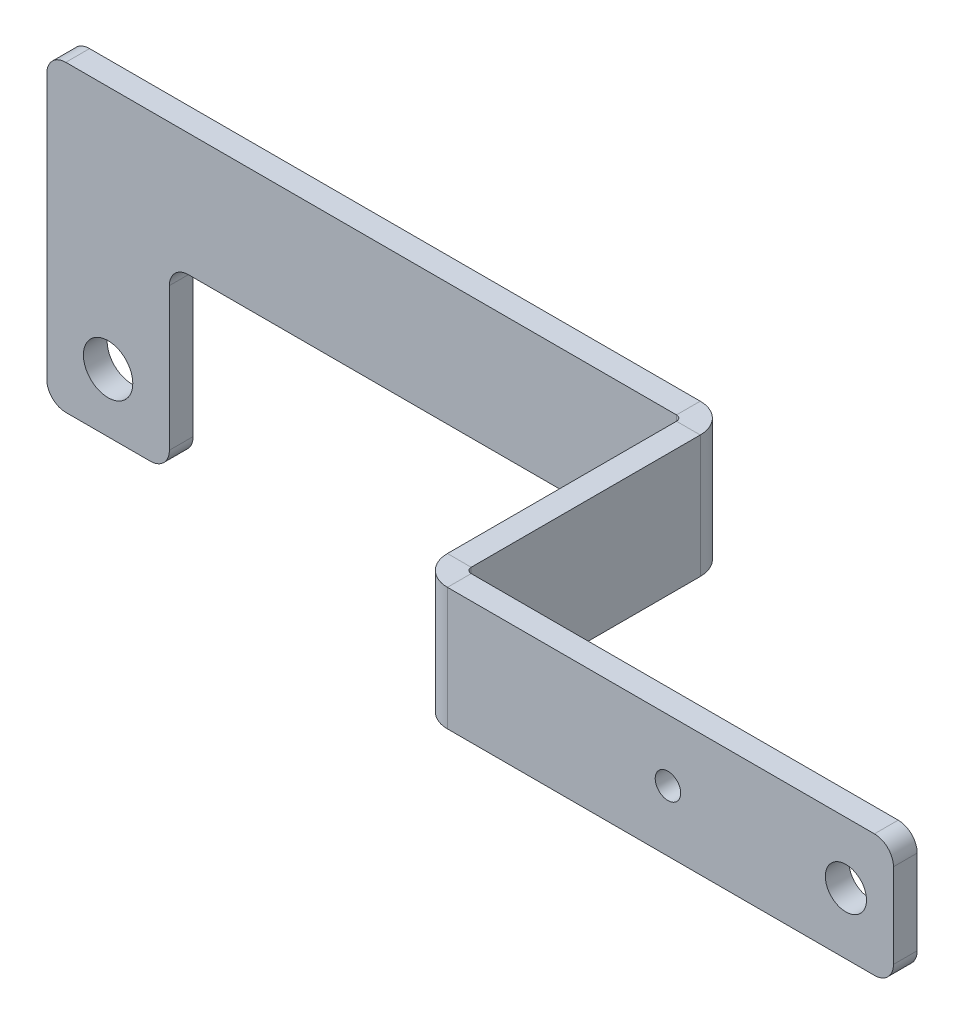
ISO-10303-21;
HEADER;
FILE_DESCRIPTION(('STEP AP214'),'2;1');
FILE_NAME('part.step','',(''),(''),'','','');
FILE_SCHEMA(('AUTOMOTIVE_DESIGN { 1 0 10303 214 1 1 1 1 }'));
ENDSEC;
DATA;
#1=APPLICATION_CONTEXT('core data for automotive mechanical design processes');
#2=APPLICATION_PROTOCOL_DEFINITION('international standard','automotive_design',2000,#1);
#3=PRODUCT_CONTEXT('',#1,'mechanical');
#4=PRODUCT('Part','Part','',(#3));
#5=PRODUCT_RELATED_PRODUCT_CATEGORY('part','',(#4));
#6=PRODUCT_DEFINITION_FORMATION('','',#4);
#7=PRODUCT_DEFINITION_CONTEXT('part definition',#1,'design');
#8=PRODUCT_DEFINITION('design','',#6,#7);
#9=PRODUCT_DEFINITION_SHAPE('','',#8);
#10=(LENGTH_UNIT() NAMED_UNIT(*) SI_UNIT(.MILLI.,.METRE.));
#11=(NAMED_UNIT(*) PLANE_ANGLE_UNIT() SI_UNIT($,.RADIAN.));
#12=(NAMED_UNIT(*) SI_UNIT($,.STERADIAN.) SOLID_ANGLE_UNIT());
#13=UNCERTAINTY_MEASURE_WITH_UNIT(LENGTH_MEASURE(1.E-05),#10,'distance_accuracy_value','');
#14=(GEOMETRIC_REPRESENTATION_CONTEXT(3) GLOBAL_UNCERTAINTY_ASSIGNED_CONTEXT((#13)) GLOBAL_UNIT_ASSIGNED_CONTEXT((#10,
#11,#12)) REPRESENTATION_CONTEXT('',''));
#15=CARTESIAN_POINT('',(0.,0.,0.));
#16=DIRECTION('',(0.,0.,1.));
#17=DIRECTION('',(1.,0.,0.));
#18=AXIS2_PLACEMENT_3D('',#15,#16,#17);
#19=CARTESIAN_POINT('',(65.8241,-45.5626000012021,0.));
#20=DIRECTION('',(0.,1.,0.));
#21=DIRECTION('',(0.,0.,1.));
#22=AXIS2_PLACEMENT_3D('',#19,#20,#21);
#23=PLANE('',#22);
#24=DIRECTION('',(-1.,0.,0.));
#25=VECTOR('',#24,1.);
#26=CARTESIAN_POINT('',(65.8241000000001,-45.5626000012021,31.3413));
#27=LINE('',#26,#25);
#28=CARTESIAN_POINT('',(65.8241000000001,-45.5626000012021,31.3413));
#29=VERTEX_POINT('',#28);
#30=CARTESIAN_POINT('',(62.6491000000001,-45.5626000012021,31.3413));
#31=VERTEX_POINT('',#30);
#32=EDGE_CURVE('E252',#29,#31,#27,.T.);
#33=ORIENTED_EDGE('',*,*,#32,.T.);
#34=DIRECTION('',(0.,0.,1.));
#35=VECTOR('',#34,1.);
#36=CARTESIAN_POINT('',(62.6491,-45.5626000012021,0.));
#37=LINE('',#36,#35);
#38=CARTESIAN_POINT('',(62.6491,-45.562600001202,0.736599999999997));
#39=VERTEX_POINT('',#38);
#40=EDGE_CURVE('E281',#31,#39,#37,.F.);
#41=ORIENTED_EDGE('',*,*,#40,.T.);
#42=DIRECTION('',(-1.,0.,0.));
#43=VECTOR('',#42,1.);
#44=CARTESIAN_POINT('',(65.8241,-45.5626000012021,0.736599999999986));
#45=LINE('',#44,#43);
#46=CARTESIAN_POINT('',(65.8241,-45.562600001202,0.736599999999986));
#47=VERTEX_POINT('',#46);
#48=EDGE_CURVE('E266',#39,#47,#45,.F.);
#49=ORIENTED_EDGE('',*,*,#48,.T.);
#50=DIRECTION('',(0.,0.,-1.));
#51=VECTOR('',#50,1.);
#52=CARTESIAN_POINT('',(65.8241,-45.5626000012021,-2.25365948582831E-13));
#53=LINE('',#52,#51);
#54=EDGE_CURVE('E274',#29,#47,#53,.T.);
#55=ORIENTED_EDGE('',*,*,#54,.F.);
#56=EDGE_LOOP('',(#33,#41,#49,#55));
#57=FACE_BOUND('',#56,.T.);
#58=ADVANCED_FACE('F60',(#57),#23,.F.);
#59=CARTESIAN_POINT('',(65.8241000000001,-29.1846000012021,32.0779));
#60=DIRECTION('',(0.,-1.,0.));
#61=DIRECTION('',(0.,0.,-1.));
#62=AXIS2_PLACEMENT_3D('',#59,#60,#61);
#63=PLANE('',#62);
#64=DIRECTION('',(-1.,0.,0.));
#65=VECTOR('',#64,1.);
#66=CARTESIAN_POINT('',(65.8241000000001,-29.1846000012021,31.3413));
#67=LINE('',#66,#65);
#68=CARTESIAN_POINT('',(65.8241000000001,-29.1846000012021,31.3413));
#69=VERTEX_POINT('',#68);
#70=CARTESIAN_POINT('',(62.6491000000001,-29.1846000012021,31.3413));
#71=VERTEX_POINT('',#70);
#72=EDGE_CURVE('E262',#69,#71,#67,.T.);
#73=ORIENTED_EDGE('',*,*,#72,.F.);
#74=DIRECTION('',(0.,0.,1.));
#75=VECTOR('',#74,1.);
#76=CARTESIAN_POINT('',(65.8241,-29.1846000012021,-2.28522465110352E-13));
#77=LINE('',#76,#75);
#78=CARTESIAN_POINT('',(65.8241,-29.1846000012021,0.736599999999986));
#79=VERTEX_POINT('',#78);
#80=EDGE_CURVE('E269',#79,#69,#77,.T.);
#81=ORIENTED_EDGE('',*,*,#80,.F.);
#82=DIRECTION('',(-1.,0.,0.));
#83=VECTOR('',#82,1.);
#84=CARTESIAN_POINT('',(62.6491,-29.1846000012021,0.736599999999997));
#85=LINE('',#84,#83);
#86=CARTESIAN_POINT('',(62.6491,-29.1846000012021,0.736599999999997));
#87=VERTEX_POINT('',#86);
#88=EDGE_CURVE('E288',#87,#79,#85,.F.);
#89=ORIENTED_EDGE('',*,*,#88,.F.);
#90=DIRECTION('',(0.,0.,-1.));
#91=VECTOR('',#90,1.);
#92=CARTESIAN_POINT('',(62.6491000000001,-29.1846000012021,32.0779));
#93=LINE('',#92,#91);
#94=EDGE_CURVE('E277',#87,#71,#93,.F.);
#95=ORIENTED_EDGE('',*,*,#94,.T.);
#96=EDGE_LOOP('',(#73,#81,#89,#95));
#97=FACE_BOUND('',#96,.T.);
#98=ADVANCED_FACE('F505',(#97),#63,.F.);
#99=CARTESIAN_POINT('',(65.8241,0.,-2.25365948582831E-13));
#100=DIRECTION('',(-1.,0.,0.));
#101=DIRECTION('',(0.,0.,1.));
#102=AXIS2_PLACEMENT_3D('',#99,#100,#101);
#103=PLANE('',#102);
#104=DIRECTION('',(0.,-1.,0.));
#105=VECTOR('',#104,1.);
#106=CARTESIAN_POINT('',(65.8241000000001,-45.5626000012021,31.3413));
#107=LINE('',#106,#105);
#108=EDGE_CURVE('E257',#29,#69,#107,.F.);
#109=ORIENTED_EDGE('',*,*,#108,.F.);
#110=ORIENTED_EDGE('',*,*,#54,.T.);
#111=DIRECTION('',(0.,1.,0.));
#112=VECTOR('',#111,1.);
#113=CARTESIAN_POINT('',(65.8241,-45.5626000012021,0.736599999999986));
#114=LINE('',#113,#112);
#115=EDGE_CURVE('E284',#79,#47,#114,.F.);
#116=ORIENTED_EDGE('',*,*,#115,.F.);
#117=ORIENTED_EDGE('',*,*,#80,.T.);
#118=EDGE_LOOP('',(#109,#110,#116,#117));
#119=FACE_BOUND('',#118,.T.);
#120=ADVANCED_FACE('F502',(#119),#103,.F.);
#121=CARTESIAN_POINT('',(62.6491,0.,-2.14280495332004E-13));
#122=DIRECTION('',(-1.,0.,0.));
#123=DIRECTION('',(0.,0.,1.));
#124=AXIS2_PLACEMENT_3D('',#121,#122,#123);
#125=PLANE('',#124);
#126=ORIENTED_EDGE('',*,*,#40,.F.);
#127=DIRECTION('',(0.,-1.,0.));
#128=VECTOR('',#127,1.);
#129=CARTESIAN_POINT('',(62.6491000000001,-45.5626000012021,31.3413));
#130=LINE('',#129,#128);
#131=EDGE_CURVE('E207',#31,#71,#130,.F.);
#132=ORIENTED_EDGE('',*,*,#131,.T.);
#133=ORIENTED_EDGE('',*,*,#94,.F.);
#134=DIRECTION('',(0.,1.,0.));
#135=VECTOR('',#134,1.);
#136=CARTESIAN_POINT('',(62.6491,-45.5626000012021,0.736599999999997));
#137=LINE('',#136,#135);
#138=EDGE_CURVE('E292',#39,#87,#137,.T.);
#139=ORIENTED_EDGE('',*,*,#138,.F.);
#140=EDGE_LOOP('',(#126,#132,#133,#139));
#141=FACE_BOUND('',#140,.T.);
#142=ADVANCED_FACE('F513',(#141),#125,.T.);
#143=CARTESIAN_POINT('',(-5.83789999499929,-69.6926000012021,-3.175));
#144=DIRECTION('',(0.,-1.,0.));
#145=DIRECTION('',(0.,0.,-1.));
#146=AXIS2_PLACEMENT_3D('',#143,#144,#145);
#147=PLANE('',#146);
#148=DIRECTION('',(1.,0.,0.));
#149=VECTOR('',#148,1.);
#150=CARTESIAN_POINT('',(-5.83789999499929,-69.6926000012021,0.));
#151=LINE('',#150,#149);
#152=CARTESIAN_POINT('',(-19.6759000049993,-69.6926000012021,0.));
#153=VERTEX_POINT('',#152);
#154=CARTESIAN_POINT('',(-8.37789999499929,-69.6926000012021,0.));
#155=VERTEX_POINT('',#154);
#156=EDGE_CURVE('E302',#153,#155,#151,.T.);
#157=ORIENTED_EDGE('',*,*,#156,.F.);
#158=DIRECTION('',(0.,0.,1.));
#159=VECTOR('',#158,1.);
#160=CARTESIAN_POINT('',(-19.6759000049993,-69.6926000012021,-3.175));
#161=LINE('',#160,#159);
#162=CARTESIAN_POINT('',(-19.6759000049993,-69.6926000012021,-3.175));
#163=VERTEX_POINT('',#162);
#164=EDGE_CURVE('E393',#153,#163,#161,.F.);
#165=ORIENTED_EDGE('',*,*,#164,.T.);
#166=DIRECTION('',(1.,0.,0.));
#167=VECTOR('',#166,1.);
#168=CARTESIAN_POINT('',(-5.83789999499929,-69.6926000012021,-3.175));
#169=LINE('',#168,#167);
#170=CARTESIAN_POINT('',(-8.37789999499929,-69.6926000012021,-3.175));
#171=VERTEX_POINT('',#170);
#172=EDGE_CURVE('E314',#163,#171,#169,.T.);
#173=ORIENTED_EDGE('',*,*,#172,.T.);
#174=DIRECTION('',(0.,0.,1.));
#175=VECTOR('',#174,1.);
#176=CARTESIAN_POINT('',(-8.37789999499929,-69.6926000012021,-3.175));
#177=LINE('',#176,#175);
#178=EDGE_CURVE('E389',#171,#155,#177,.T.);
#179=ORIENTED_EDGE('',*,*,#178,.T.);
#180=EDGE_LOOP('',(#157,#165,#173,#179));
#181=FACE_BOUND('',#180,.T.);
#182=ADVANCED_FACE('F472',(#181),#147,.T.);
#183=CARTESIAN_POINT('',(-22.2159000049993,-29.1846000012021,-3.175));
#184=DIRECTION('',(-1.,0.,0.));
#185=DIRECTION('',(0.,0.,1.));
#186=AXIS2_PLACEMENT_3D('',#183,#184,#185);
#187=PLANE('',#186);
#188=DIRECTION('',(0.,-1.,0.));
#189=VECTOR('',#188,1.);
#190=CARTESIAN_POINT('',(-22.2159000049993,-29.1846000012021,-3.175));
#191=LINE('',#190,#189);
#192=CARTESIAN_POINT('',(-22.2159000049993,-31.7246000012021,-3.175));
#193=VERTEX_POINT('',#192);
#194=CARTESIAN_POINT('',(-22.2159000049993,-67.1526000012021,-3.175));
#195=VERTEX_POINT('',#194);
#196=EDGE_CURVE('E334',#193,#195,#191,.T.);
#197=ORIENTED_EDGE('',*,*,#196,.T.);
#198=DIRECTION('',(0.,0.,1.));
#199=VECTOR('',#198,1.);
#200=CARTESIAN_POINT('',(-22.2159000049993,-67.1526000012021,-3.175));
#201=LINE('',#200,#199);
#202=CARTESIAN_POINT('',(-22.2159000049993,-67.1526000012021,0.));
#203=VERTEX_POINT('',#202);
#204=EDGE_CURVE('E376',#195,#203,#201,.T.);
#205=ORIENTED_EDGE('',*,*,#204,.T.);
#206=DIRECTION('',(0.,-1.,0.));
#207=VECTOR('',#206,1.);
#208=CARTESIAN_POINT('',(-22.2159000049993,-29.1846000012021,0.));
#209=LINE('',#208,#207);
#210=CARTESIAN_POINT('',(-22.2159000049993,-31.7246000012021,0.));
#211=VERTEX_POINT('',#210);
#212=EDGE_CURVE('E319',#211,#203,#209,.T.);
#213=ORIENTED_EDGE('',*,*,#212,.F.);
#214=DIRECTION('',(0.,0.,1.));
#215=VECTOR('',#214,1.);
#216=CARTESIAN_POINT('',(-22.2159000049993,-31.7246000012021,-3.175));
#217=LINE('',#216,#215);
#218=EDGE_CURVE('E364',#211,#193,#217,.F.);
#219=ORIENTED_EDGE('',*,*,#218,.T.);
#220=EDGE_LOOP('',(#197,#205,#213,#219));
#221=FACE_BOUND('',#220,.T.);
#222=ADVANCED_FACE('F480',(#221),#187,.T.);
#223=CARTESIAN_POINT('',(-22.2159000049993,-29.1846000012021,-3.175));
#224=DIRECTION('',(0.,1.,0.));
#225=DIRECTION('',(0.,0.,1.));
#226=AXIS2_PLACEMENT_3D('',#223,#224,#225);
#227=PLANE('',#226);
#228=DIRECTION('',(-1.,0.,0.));
#229=VECTOR('',#228,1.);
#230=CARTESIAN_POINT('',(-22.2159000049993,-29.1846000012021,-3.175));
#231=LINE('',#230,#229);
#232=CARTESIAN_POINT('',(61.9125,-29.1846000012021,-3.175));
#233=VERTEX_POINT('',#232);
#234=CARTESIAN_POINT('',(-19.6759000049993,-29.1846000012021,-3.175));
#235=VERTEX_POINT('',#234);
#236=EDGE_CURVE('E330',#233,#235,#231,.T.);
#237=ORIENTED_EDGE('',*,*,#236,.T.);
#238=DIRECTION('',(0.,0.,1.));
#239=VECTOR('',#238,1.);
#240=CARTESIAN_POINT('',(-19.6759000049993,-29.1846000012021,-3.175));
#241=LINE('',#240,#239);
#242=CARTESIAN_POINT('',(-19.6759000049993,-29.1846000012021,0.));
#243=VERTEX_POINT('',#242);
#244=EDGE_CURVE('E415',#235,#243,#241,.T.);
#245=ORIENTED_EDGE('',*,*,#244,.T.);
#246=DIRECTION('',(-1.,0.,0.));
#247=VECTOR('',#246,1.);
#248=CARTESIAN_POINT('',(-22.2159000049993,-29.1846000012021,0.));
#249=LINE('',#248,#247);
#250=CARTESIAN_POINT('',(61.9125,-29.1846000012021,0.));
#251=VERTEX_POINT('',#250);
#252=EDGE_CURVE('E353',#251,#243,#249,.T.);
#253=ORIENTED_EDGE('',*,*,#252,.F.);
#254=DIRECTION('',(0.,0.,1.));
#255=VECTOR('',#254,1.);
#256=CARTESIAN_POINT('',(61.9125,-29.1846000012021,-3.175));
#257=LINE('',#256,#255);
#258=EDGE_CURVE('E360',#233,#251,#257,.T.);
#259=ORIENTED_EDGE('',*,*,#258,.F.);
#260=EDGE_LOOP('',(#237,#245,#253,#259));
#261=FACE_BOUND('',#260,.T.);
#262=ADVANCED_FACE('F488',(#261),#227,.T.);
#263=CARTESIAN_POINT('',(-5.8378999949993,-45.5626000012021,-3.175));
#264=DIRECTION('',(0.,-1.,0.));
#265=DIRECTION('',(1.,0.,0.));
#266=AXIS2_PLACEMENT_3D('',#263,#264,#265);
#267=PLANE('',#266);
#268=DIRECTION('',(1.,0.,0.));
#269=VECTOR('',#268,1.);
#270=CARTESIAN_POINT('',(-5.8378999949993,-45.5626000012021,0.));
#271=LINE('',#270,#269);
#272=CARTESIAN_POINT('',(-3.29789999499929,-45.5626000012021,0.));
#273=VERTEX_POINT('',#272);
#274=CARTESIAN_POINT('',(61.9125,-45.5626000012021,0.));
#275=VERTEX_POINT('',#274);
#276=EDGE_CURVE('E346',#273,#275,#271,.T.);
#277=ORIENTED_EDGE('',*,*,#276,.F.);
#278=DIRECTION('',(0.,0.,1.));
#279=VECTOR('',#278,1.);
#280=CARTESIAN_POINT('',(-3.29789999499929,-45.5626000012021,-3.175));
#281=LINE('',#280,#279);
#282=CARTESIAN_POINT('',(-3.29789999499929,-45.5626000012021,-3.175));
#283=VERTEX_POINT('',#282);
#284=EDGE_CURVE('E412',#273,#283,#281,.F.);
#285=ORIENTED_EDGE('',*,*,#284,.T.);
#286=DIRECTION('',(1.,0.,0.));
#287=VECTOR('',#286,1.);
#288=CARTESIAN_POINT('',(-5.8378999949993,-45.5626000012021,-3.175));
#289=LINE('',#288,#287);
#290=CARTESIAN_POINT('',(61.9125,-45.5626000012021,-3.175));
#291=VERTEX_POINT('',#290);
#292=EDGE_CURVE('E323',#283,#291,#289,.T.);
#293=ORIENTED_EDGE('',*,*,#292,.T.);
#294=DIRECTION('',(0.,0.,1.));
#295=VECTOR('',#294,1.);
#296=CARTESIAN_POINT('',(61.9125,-45.5626000012021,-3.175));
#297=LINE('',#296,#295);
#298=EDGE_CURVE('E338',#291,#275,#297,.T.);
#299=ORIENTED_EDGE('',*,*,#298,.T.);
#300=EDGE_LOOP('',(#277,#285,#293,#299));
#301=FACE_BOUND('',#300,.T.);
#302=ADVANCED_FACE('F451',(#301),#267,.T.);
#303=CARTESIAN_POINT('',(-5.83789999499929,-69.6926000012021,-3.175));
#304=DIRECTION('',(1.,0.,0.));
#305=DIRECTION('',(0.,1.,0.));
#306=AXIS2_PLACEMENT_3D('',#303,#304,#305);
#307=PLANE('',#306);
#308=DIRECTION('',(0.,1.,0.));
#309=VECTOR('',#308,1.);
#310=CARTESIAN_POINT('',(-5.83789999499929,-69.6926000012021,0.));
#311=LINE('',#310,#309);
#312=CARTESIAN_POINT('',(-5.83789999499929,-67.1526000012021,0.));
#313=VERTEX_POINT('',#312);
#314=CARTESIAN_POINT('',(-5.83789999499929,-48.1026000012021,0.));
#315=VERTEX_POINT('',#314);
#316=EDGE_CURVE('E342',#313,#315,#311,.T.);
#317=ORIENTED_EDGE('',*,*,#316,.F.);
#318=DIRECTION('',(0.,0.,1.));
#319=VECTOR('',#318,1.);
#320=CARTESIAN_POINT('',(-5.83789999499929,-67.1526000012021,-3.175));
#321=LINE('',#320,#319);
#322=CARTESIAN_POINT('',(-5.83789999499929,-67.1526000012021,-3.175));
#323=VERTEX_POINT('',#322);
#324=EDGE_CURVE('E409',#313,#323,#321,.F.);
#325=ORIENTED_EDGE('',*,*,#324,.T.);
#326=DIRECTION('',(0.,1.,0.));
#327=VECTOR('',#326,1.);
#328=CARTESIAN_POINT('',(-5.83789999499929,-69.6926000012021,-3.175));
#329=LINE('',#328,#327);
#330=CARTESIAN_POINT('',(-5.83789999499929,-48.1026000012021,-3.175));
#331=VERTEX_POINT('',#330);
#332=EDGE_CURVE('E318',#323,#331,#329,.T.);
#333=ORIENTED_EDGE('',*,*,#332,.T.);
#334=DIRECTION('',(0.,0.,1.));
#335=VECTOR('',#334,1.);
#336=CARTESIAN_POINT('',(-5.83789999499929,-48.1026000012021,0.));
#337=LINE('',#336,#335);
#338=EDGE_CURVE('E405',#331,#315,#337,.T.);
#339=ORIENTED_EDGE('',*,*,#338,.T.);
#340=EDGE_LOOP('',(#317,#325,#333,#339));
#341=FACE_BOUND('',#340,.T.);
#342=ADVANCED_FACE('F464',(#341),#307,.T.);
#343=CARTESIAN_POINT('',(0.,0.,-3.175));
#344=DIRECTION('',(0.,0.,1.));
#345=DIRECTION('',(1.,0.,0.));
#346=AXIS2_PLACEMENT_3D('',#343,#344,#345);
#347=PLANE('',#346);
#348=CARTESIAN_POINT('',(-14.0268999999988,-61.8656000012064,-3.175));
#349=DIRECTION('',(0.,0.,1.));
#350=DIRECTION('',(1.,0.,0.));
#351=AXIS2_PLACEMENT_3D('',#348,#349,#350);
#352=CIRCLE('',#351,3.3);
#353=CARTESIAN_POINT('',(-10.7268999999988,-61.8656000012064,-3.175));
#354=VERTEX_POINT('',#353);
#355=EDGE_CURVE('E599',#354,#354,#352,.T.);
#356=ORIENTED_EDGE('',*,*,#355,.T.);
#357=EDGE_LOOP('',(#356));
#358=FACE_BOUND('',#357,.T.);
#359=ORIENTED_EDGE('',*,*,#172,.F.);
#360=CARTESIAN_POINT('',(-19.6759000049993,-67.1526000012021,-3.175));
#361=DIRECTION('',(0.,0.,1.));
#362=DIRECTION('',(1.,0.,0.));
#363=AXIS2_PLACEMENT_3D('',#360,#361,#362);
#364=CIRCLE('',#363,2.54);
#365=EDGE_CURVE('E402',#163,#195,#364,.F.);
#366=ORIENTED_EDGE('',*,*,#365,.T.);
#367=ORIENTED_EDGE('',*,*,#196,.F.);
#368=CARTESIAN_POINT('',(-19.6759000049993,-31.7246000012021,-3.175));
#369=DIRECTION('',(0.,0.,1.));
#370=DIRECTION('',(1.,0.,0.));
#371=AXIS2_PLACEMENT_3D('',#368,#369,#370);
#372=CIRCLE('',#371,2.54);
#373=EDGE_CURVE('E396',#193,#235,#372,.F.);
#374=ORIENTED_EDGE('',*,*,#373,.T.);
#375=ORIENTED_EDGE('',*,*,#236,.F.);
#376=DIRECTION('',(0.,1.,0.));
#377=VECTOR('',#376,1.);
#378=CARTESIAN_POINT('',(61.9125,-45.5626000012021,-3.175));
#379=LINE('',#378,#377);
#380=EDGE_CURVE('E326',#291,#233,#379,.T.);
#381=ORIENTED_EDGE('',*,*,#380,.F.);
#382=ORIENTED_EDGE('',*,*,#292,.F.);
#383=CARTESIAN_POINT('',(-3.29789999499929,-48.1026000012021,-3.175));
#384=DIRECTION('',(0.,0.,1.));
#385=DIRECTION('',(1.,0.,0.));
#386=AXIS2_PLACEMENT_3D('',#383,#384,#385);
#387=CIRCLE('',#386,2.54);
#388=EDGE_CURVE('E13',#283,#331,#387,.T.);
#389=ORIENTED_EDGE('',*,*,#388,.T.);
#390=ORIENTED_EDGE('',*,*,#332,.F.);
#391=CARTESIAN_POINT('',(-8.37789999499929,-67.1526000012021,-3.175));
#392=DIRECTION('',(0.,0.,1.));
#393=DIRECTION('',(1.,0.,0.));
#394=AXIS2_PLACEMENT_3D('',#391,#392,#393);
#395=CIRCLE('',#394,2.54);
#396=EDGE_CURVE('E399',#323,#171,#395,.F.);
#397=ORIENTED_EDGE('',*,*,#396,.T.);
#398=EDGE_LOOP('',(#359,#366,#367,#374,#375,#381,#382,#389,#390,#397));
#399=FACE_BOUND('',#398,.T.);
#400=ADVANCED_FACE('F460',(#358,#399),#347,.F.);
#401=CARTESIAN_POINT('',(0.,0.,0.));
#402=DIRECTION('',(0.,0.,1.));
#403=DIRECTION('',(1.,0.,0.));
#404=AXIS2_PLACEMENT_3D('',#401,#402,#403);
#405=PLANE('',#404);
#406=CARTESIAN_POINT('',(-14.0268999999988,-61.8656000012064,0.));
#407=DIRECTION('',(0.,0.,1.));
#408=DIRECTION('',(1.,0.,0.));
#409=AXIS2_PLACEMENT_3D('',#406,#407,#408);
#410=CIRCLE('',#409,3.3);
#411=CARTESIAN_POINT('',(-10.7268999999988,-61.8656000012064,0.));
#412=VERTEX_POINT('',#411);
#413=EDGE_CURVE('E593',#412,#412,#410,.T.);
#414=ORIENTED_EDGE('',*,*,#413,.F.);
#415=EDGE_LOOP('',(#414));
#416=FACE_BOUND('',#415,.T.);
#417=ORIENTED_EDGE('',*,*,#212,.T.);
#418=CARTESIAN_POINT('',(-19.6759000049993,-67.1526000012021,0.));
#419=DIRECTION('',(0.,0.,1.));
#420=DIRECTION('',(1.,0.,0.));
#421=AXIS2_PLACEMENT_3D('',#418,#419,#420);
#422=CIRCLE('',#421,2.54);
#423=EDGE_CURVE('E386',#203,#153,#422,.T.);
#424=ORIENTED_EDGE('',*,*,#423,.T.);
#425=ORIENTED_EDGE('',*,*,#156,.T.);
#426=CARTESIAN_POINT('',(-8.37789999499929,-67.1526000012021,0.));
#427=DIRECTION('',(0.,0.,1.));
#428=DIRECTION('',(1.,0.,0.));
#429=AXIS2_PLACEMENT_3D('',#426,#427,#428);
#430=CIRCLE('',#429,2.54);
#431=EDGE_CURVE('E383',#155,#313,#430,.T.);
#432=ORIENTED_EDGE('',*,*,#431,.T.);
#433=ORIENTED_EDGE('',*,*,#316,.T.);
#434=CARTESIAN_POINT('',(-3.29789999499929,-48.1026000012021,0.));
#435=DIRECTION('',(0.,0.,1.));
#436=DIRECTION('',(1.,0.,0.));
#437=AXIS2_PLACEMENT_3D('',#434,#435,#436);
#438=CIRCLE('',#437,2.54);
#439=EDGE_CURVE('E69',#315,#273,#438,.F.);
#440=ORIENTED_EDGE('',*,*,#439,.T.);
#441=ORIENTED_EDGE('',*,*,#276,.T.);
#442=DIRECTION('',(0.,1.,0.));
#443=VECTOR('',#442,1.);
#444=CARTESIAN_POINT('',(61.9125,-45.5626000012021,0.));
#445=LINE('',#444,#443);
#446=EDGE_CURVE('E349',#275,#251,#445,.T.);
#447=ORIENTED_EDGE('',*,*,#446,.T.);
#448=ORIENTED_EDGE('',*,*,#252,.T.);
#449=CARTESIAN_POINT('',(-19.6759000049993,-31.7246000012021,0.));
#450=DIRECTION('',(0.,0.,1.));
#451=DIRECTION('',(1.,0.,0.));
#452=AXIS2_PLACEMENT_3D('',#449,#450,#451);
#453=CIRCLE('',#452,2.54);
#454=EDGE_CURVE('E380',#243,#211,#453,.T.);
#455=ORIENTED_EDGE('',*,*,#454,.T.);
#456=EDGE_LOOP('',(#417,#424,#425,#432,#433,#440,#441,#447,#448,#455));
#457=FACE_BOUND('',#456,.T.);
#458=ADVANCED_FACE('F445',(#416,#457),#405,.T.);
#459=CARTESIAN_POINT('',(61.9125,-45.5626000012021,0.7366));
#460=DIRECTION('',(0.,-1.,0.));
#461=DIRECTION('',(0.,0.,-1.));
#462=AXIS2_PLACEMENT_3D('',#459,#460,#461);
#463=PLANE('',#462);
#464=ORIENTED_EDGE('',*,*,#48,.F.);
#465=CARTESIAN_POINT('',(61.9125,-45.5626000012021,0.7366));
#466=DIRECTION('',(0.,1.,0.));
#467=DIRECTION('',(0.,0.,1.));
#468=AXIS2_PLACEMENT_3D('',#465,#466,#467);
#469=CIRCLE('',#468,0.736599999999997);
#470=EDGE_CURVE('E307',#275,#39,#469,.F.);
#471=ORIENTED_EDGE('',*,*,#470,.F.);
#472=ORIENTED_EDGE('',*,*,#298,.F.);
#473=CARTESIAN_POINT('',(61.9125,-45.562600001202,0.7366));
#474=DIRECTION('',(0.,1.,0.));
#475=DIRECTION('',(0.,0.,1.));
#476=AXIS2_PLACEMENT_3D('',#473,#474,#475);
#477=CIRCLE('',#476,3.9116);
#478=EDGE_CURVE('E298',#291,#47,#477,.F.);
#479=ORIENTED_EDGE('',*,*,#478,.T.);
#480=EDGE_LOOP('',(#464,#471,#472,#479));
#481=FACE_BOUND('',#480,.T.);
#482=ADVANCED_FACE('F519',(#481),#463,.T.);
#483=CARTESIAN_POINT('',(61.9125,-29.1846000012021,0.7366));
#484=DIRECTION('',(0.,-1.,0.));
#485=DIRECTION('',(0.,0.,-1.));
#486=AXIS2_PLACEMENT_3D('',#483,#484,#485);
#487=PLANE('',#486);
#488=CARTESIAN_POINT('',(61.9125,-29.1846000012021,0.7366));
#489=DIRECTION('',(0.,1.,0.));
#490=DIRECTION('',(0.,0.,1.));
#491=AXIS2_PLACEMENT_3D('',#488,#489,#490);
#492=CIRCLE('',#491,0.736599999999997);
#493=EDGE_CURVE('E273',#87,#251,#492,.T.);
#494=ORIENTED_EDGE('',*,*,#493,.F.);
#495=ORIENTED_EDGE('',*,*,#88,.T.);
#496=CARTESIAN_POINT('',(61.9125,-29.1846000012021,0.7366));
#497=DIRECTION('',(0.,1.,0.));
#498=DIRECTION('',(0.,0.,1.));
#499=AXIS2_PLACEMENT_3D('',#496,#497,#498);
#500=CIRCLE('',#499,3.9116);
#501=EDGE_CURVE('E303',#79,#233,#500,.T.);
#502=ORIENTED_EDGE('',*,*,#501,.T.);
#503=ORIENTED_EDGE('',*,*,#258,.T.);
#504=EDGE_LOOP('',(#494,#495,#502,#503));
#505=FACE_BOUND('',#504,.T.);
#506=ADVANCED_FACE('F494',(#505),#487,.F.);
#507=CARTESIAN_POINT('',(61.9125,-29.1846000012021,0.7366));
#508=DIRECTION('',(0.,1.,0.));
#509=DIRECTION('',(1.,0.,0.));
#510=AXIS2_PLACEMENT_3D('',#507,#508,#509);
#511=CYLINDRICAL_SURFACE('',#510,3.9116);
#512=ORIENTED_EDGE('',*,*,#380,.T.);
#513=ORIENTED_EDGE('',*,*,#501,.F.);
#514=ORIENTED_EDGE('',*,*,#115,.T.);
#515=ORIENTED_EDGE('',*,*,#478,.F.);
#516=EDGE_LOOP('',(#512,#513,#514,#515));
#517=FACE_BOUND('',#516,.T.);
#518=ADVANCED_FACE('F493',(#517),#511,.T.);
#519=CARTESIAN_POINT('',(61.9125,-29.1846000012021,0.7366));
#520=DIRECTION('',(0.,1.,0.));
#521=DIRECTION('',(1.,0.,0.));
#522=AXIS2_PLACEMENT_3D('',#519,#520,#521);
#523=CYLINDRICAL_SURFACE('',#522,0.736599999999997);
#524=ORIENTED_EDGE('',*,*,#446,.F.);
#525=ORIENTED_EDGE('',*,*,#470,.T.);
#526=ORIENTED_EDGE('',*,*,#138,.T.);
#527=ORIENTED_EDGE('',*,*,#493,.T.);
#528=EDGE_LOOP('',(#524,#525,#526,#527));
#529=FACE_BOUND('',#528,.T.);
#530=ADVANCED_FACE('F521',(#529),#523,.F.);
#531=CARTESIAN_POINT('',(66.5607000000001,-29.1846000012021,31.3413));
#532=DIRECTION('',(0.,1.,0.));
#533=DIRECTION('',(0.,0.,1.));
#534=AXIS2_PLACEMENT_3D('',#531,#532,#533);
#535=PLANE('',#534);
#536=DIRECTION('',(0.,0.,1.));
#537=VECTOR('',#536,1.);
#538=CARTESIAN_POINT('',(66.5607000000001,-29.1846000012021,32.0779));
#539=LINE('',#538,#537);
#540=CARTESIAN_POINT('',(66.5607000000001,-29.1846000012021,32.0779));
#541=VERTEX_POINT('',#540);
#542=CARTESIAN_POINT('',(66.5607000000001,-29.1846000012021,35.2529));
#543=VERTEX_POINT('',#542);
#544=EDGE_CURVE('E372',#541,#543,#539,.T.);
#545=ORIENTED_EDGE('',*,*,#544,.F.);
#546=CARTESIAN_POINT('',(66.5607000000001,-29.1846000012021,31.3413));
#547=DIRECTION('',(0.,-1.,0.));
#548=DIRECTION('',(0.,0.,-1.));
#549=AXIS2_PLACEMENT_3D('',#546,#547,#548);
#550=CIRCLE('',#549,0.736599999999997);
#551=EDGE_CURVE('E211',#69,#541,#550,.F.);
#552=ORIENTED_EDGE('',*,*,#551,.F.);
#553=ORIENTED_EDGE('',*,*,#72,.T.);
#554=CARTESIAN_POINT('',(66.5607000000001,-29.1846000012021,31.3413));
#555=DIRECTION('',(0.,-1.,0.));
#556=DIRECTION('',(0.,0.,-1.));
#557=AXIS2_PLACEMENT_3D('',#554,#555,#556);
#558=CIRCLE('',#557,3.9116);
#559=EDGE_CURVE('E250',#71,#543,#558,.F.);
#560=ORIENTED_EDGE('',*,*,#559,.T.);
#561=EDGE_LOOP('',(#545,#552,#553,#560));
#562=FACE_BOUND('',#561,.T.);
#563=ADVANCED_FACE('F509',(#562),#535,.T.);
#564=CARTESIAN_POINT('',(66.5607000000001,-45.5626000012021,31.3413));
#565=DIRECTION('',(0.,1.,0.));
#566=DIRECTION('',(0.,0.,1.));
#567=AXIS2_PLACEMENT_3D('',#564,#565,#566);
#568=PLANE('',#567);
#569=CARTESIAN_POINT('',(66.5607000000001,-45.5626000012021,31.3413));
#570=DIRECTION('',(0.,-1.,0.));
#571=DIRECTION('',(0.,0.,-1.));
#572=AXIS2_PLACEMENT_3D('',#569,#570,#571);
#573=CIRCLE('',#572,0.736599999999997);
#574=CARTESIAN_POINT('',(66.5607000000001,-45.5626000012021,32.0779));
#575=VERTEX_POINT('',#574);
#576=EDGE_CURVE('E218',#575,#29,#573,.T.);
#577=ORIENTED_EDGE('',*,*,#576,.F.);
#578=DIRECTION('',(0.,0.,1.));
#579=VECTOR('',#578,1.);
#580=CARTESIAN_POINT('',(66.5607000000001,-45.5626000012021,32.0779));
#581=LINE('',#580,#579);
#582=CARTESIAN_POINT('',(66.5607000000001,-45.5626000012021,35.2529));
#583=VERTEX_POINT('',#582);
#584=EDGE_CURVE('E215',#575,#583,#581,.T.);
#585=ORIENTED_EDGE('',*,*,#584,.T.);
#586=CARTESIAN_POINT('',(66.5607000000001,-45.5626000012021,31.3413));
#587=DIRECTION('',(0.,-1.,0.));
#588=DIRECTION('',(0.,0.,-1.));
#589=AXIS2_PLACEMENT_3D('',#586,#587,#588);
#590=CIRCLE('',#589,3.9116);
#591=EDGE_CURVE('E200',#583,#31,#590,.T.);
#592=ORIENTED_EDGE('',*,*,#591,.T.);
#593=ORIENTED_EDGE('',*,*,#32,.F.);
#594=EDGE_LOOP('',(#577,#585,#592,#593));
#595=FACE_BOUND('',#594,.T.);
#596=ADVANCED_FACE('F216',(#595),#568,.F.);
#597=CARTESIAN_POINT('',(66.5607000000001,-45.5626000012021,31.3413));
#598=DIRECTION('',(0.,-1.,0.));
#599=DIRECTION('',(0.,0.,1.));
#600=AXIS2_PLACEMENT_3D('',#597,#598,#599);
#601=CYLINDRICAL_SURFACE('',#600,3.9116);
#602=ORIENTED_EDGE('',*,*,#131,.F.);
#603=ORIENTED_EDGE('',*,*,#591,.F.);
#604=DIRECTION('',(0.,1.,0.));
#605=VECTOR('',#604,1.);
#606=CARTESIAN_POINT('',(66.5607000000001,0.,35.2529));
#607=LINE('',#606,#605);
#608=EDGE_CURVE('E204',#583,#543,#607,.T.);
#609=ORIENTED_EDGE('',*,*,#608,.T.);
#610=ORIENTED_EDGE('',*,*,#559,.F.);
#611=EDGE_LOOP('',(#602,#603,#609,#610));
#612=FACE_BOUND('',#611,.T.);
#613=ADVANCED_FACE('F202',(#612),#601,.T.);
#614=CARTESIAN_POINT('',(66.5607000000001,-45.5626000012021,31.3413));
#615=DIRECTION('',(0.,-1.,0.));
#616=DIRECTION('',(0.,0.,1.));
#617=AXIS2_PLACEMENT_3D('',#614,#615,#616);
#618=CYLINDRICAL_SURFACE('',#617,0.736599999999997);
#619=ORIENTED_EDGE('',*,*,#108,.T.);
#620=ORIENTED_EDGE('',*,*,#551,.T.);
#621=DIRECTION('',(0.,-1.,0.));
#622=VECTOR('',#621,1.);
#623=CARTESIAN_POINT('',(66.5607000000001,-29.1846000012021,32.0779));
#624=LINE('',#623,#622);
#625=EDGE_CURVE('E221',#541,#575,#624,.T.);
#626=ORIENTED_EDGE('',*,*,#625,.T.);
#627=ORIENTED_EDGE('',*,*,#576,.T.);
#628=EDGE_LOOP('',(#619,#620,#626,#627));
#629=FACE_BOUND('',#628,.T.);
#630=ADVANCED_FACE('F544',(#629),#618,.F.);
#631=CARTESIAN_POINT('',(65.8241000000001,-29.1846000012021,35.2529));
#632=DIRECTION('',(0.,-1.,0.));
#633=DIRECTION('',(0.,0.,-1.));
#634=AXIS2_PLACEMENT_3D('',#631,#632,#633);
#635=PLANE('',#634);
#636=DIRECTION('',(-1.,0.,0.));
#637=VECTOR('',#636,1.);
#638=CARTESIAN_POINT('',(65.8241000000001,-29.1846000012021,35.2529));
#639=LINE('',#638,#637);
#640=CARTESIAN_POINT('',(123.6091,-29.1846000012021,35.2529));
#641=VERTEX_POINT('',#640);
#642=EDGE_CURVE('E226',#641,#543,#639,.T.);
#643=ORIENTED_EDGE('',*,*,#642,.F.);
#644=DIRECTION('',(0.,0.,-1.));
#645=VECTOR('',#644,1.);
#646=CARTESIAN_POINT('',(123.6091,-29.1846000012021,35.2529));
#647=LINE('',#646,#645);
#648=CARTESIAN_POINT('',(123.6091,-29.1846000012021,32.0779));
#649=VERTEX_POINT('',#648);
#650=EDGE_CURVE('E439',#641,#649,#647,.T.);
#651=ORIENTED_EDGE('',*,*,#650,.T.);
#652=DIRECTION('',(-1.,0.,0.));
#653=VECTOR('',#652,1.);
#654=CARTESIAN_POINT('',(65.8241000000001,-29.1846000012021,32.0779));
#655=LINE('',#654,#653);
#656=EDGE_CURVE('E228',#649,#541,#655,.T.);
#657=ORIENTED_EDGE('',*,*,#656,.T.);
#658=ORIENTED_EDGE('',*,*,#544,.T.);
#659=EDGE_LOOP('',(#643,#651,#657,#658));
#660=FACE_BOUND('',#659,.T.);
#661=ADVANCED_FACE('F547',(#660),#635,.F.);
#662=CARTESIAN_POINT('',(126.1491,-45.5626000012021,35.2529));
#663=DIRECTION('',(0.,1.,0.));
#664=DIRECTION('',(0.,0.,1.));
#665=AXIS2_PLACEMENT_3D('',#662,#663,#664);
#666=PLANE('',#665);
#667=DIRECTION('',(1.,0.,0.));
#668=VECTOR('',#667,1.);
#669=CARTESIAN_POINT('',(126.1491,-45.5626000012021,32.0779));
#670=LINE('',#669,#668);
#671=CARTESIAN_POINT('',(123.6091,-45.5626000012021,32.0779));
#672=VERTEX_POINT('',#671);
#673=EDGE_CURVE('E242',#575,#672,#670,.T.);
#674=ORIENTED_EDGE('',*,*,#673,.T.);
#675=DIRECTION('',(0.,0.,-1.));
#676=VECTOR('',#675,1.);
#677=CARTESIAN_POINT('',(123.6091,-45.5626000012021,35.2529));
#678=LINE('',#677,#676);
#679=CARTESIAN_POINT('',(123.6091,-45.5626000012021,35.2529));
#680=VERTEX_POINT('',#679);
#681=EDGE_CURVE('E84',#672,#680,#678,.F.);
#682=ORIENTED_EDGE('',*,*,#681,.T.);
#683=DIRECTION('',(1.,0.,0.));
#684=VECTOR('',#683,1.);
#685=CARTESIAN_POINT('',(126.1491,-45.5626000012021,35.2529));
#686=LINE('',#685,#684);
#687=EDGE_CURVE('E224',#583,#680,#686,.T.);
#688=ORIENTED_EDGE('',*,*,#687,.F.);
#689=ORIENTED_EDGE('',*,*,#584,.F.);
#690=EDGE_LOOP('',(#674,#682,#688,#689));
#691=FACE_BOUND('',#690,.T.);
#692=ADVANCED_FACE('F230',(#691),#666,.F.);
#693=CARTESIAN_POINT('',(0.,0.,35.2529));
#694=DIRECTION('',(0.,0.,-1.));
#695=DIRECTION('',(-1.,0.,0.));
#696=AXIS2_PLACEMENT_3D('',#693,#694,#695);
#697=PLANE('',#696);
#698=CARTESIAN_POINT('',(96.0232000000006,-37.4236000011988,35.2529));
#699=DIRECTION('',(0.,0.,1.));
#700=DIRECTION('',(1.,0.,0.));
#701=AXIS2_PLACEMENT_3D('',#698,#699,#700);
#702=CIRCLE('',#701,1.69999999999999);
#703=CARTESIAN_POINT('',(97.7232000000005,-37.4236000011988,35.2529));
#704=VERTEX_POINT('',#703);
#705=EDGE_CURVE('E589',#704,#704,#702,.T.);
#706=ORIENTED_EDGE('',*,*,#705,.F.);
#707=EDGE_LOOP('',(#706));
#708=FACE_BOUND('',#707,.T.);
#709=CARTESIAN_POINT('',(119.7991,-37.373600001202,35.2529));
#710=DIRECTION('',(0.,0.,1.));
#711=DIRECTION('',(1.,0.,0.));
#712=AXIS2_PLACEMENT_3D('',#709,#710,#711);
#713=CIRCLE('',#712,2.75);
#714=CARTESIAN_POINT('',(122.5491,-37.373600001202,35.2529));
#715=VERTEX_POINT('',#714);
#716=EDGE_CURVE('E373',#715,#715,#713,.T.);
#717=ORIENTED_EDGE('',*,*,#716,.F.);
#718=EDGE_LOOP('',(#717));
#719=FACE_BOUND('',#718,.T.);
#720=ORIENTED_EDGE('',*,*,#687,.T.);
#721=CARTESIAN_POINT('',(123.6091,-43.0226000012021,35.2529));
#722=DIRECTION('',(0.,0.,-1.));
#723=DIRECTION('',(-1.,0.,0.));
#724=AXIS2_PLACEMENT_3D('',#721,#722,#723);
#725=CIRCLE('',#724,2.54);
#726=CARTESIAN_POINT('',(126.1491,-43.0226000012021,35.2529));
#727=VERTEX_POINT('',#726);
#728=EDGE_CURVE('E436',#680,#727,#725,.F.);
#729=ORIENTED_EDGE('',*,*,#728,.T.);
#730=DIRECTION('',(0.,1.,0.));
#731=VECTOR('',#730,1.);
#732=CARTESIAN_POINT('',(126.1491,-29.1846000012021,35.2529));
#733=LINE('',#732,#731);
#734=CARTESIAN_POINT('',(126.1491,-31.7246000012021,35.2529));
#735=VERTEX_POINT('',#734);
#736=EDGE_CURVE('E232',#727,#735,#733,.T.);
#737=ORIENTED_EDGE('',*,*,#736,.T.);
#738=CARTESIAN_POINT('',(123.6091,-31.7246000012021,35.2529));
#739=DIRECTION('',(0.,0.,-1.));
#740=DIRECTION('',(-1.,0.,0.));
#741=AXIS2_PLACEMENT_3D('',#738,#739,#740);
#742=CIRCLE('',#741,2.54);
#743=EDGE_CURVE('E76',#735,#641,#742,.F.);
#744=ORIENTED_EDGE('',*,*,#743,.T.);
#745=ORIENTED_EDGE('',*,*,#642,.T.);
#746=ORIENTED_EDGE('',*,*,#608,.F.);
#747=EDGE_LOOP('',(#720,#729,#737,#744,#745,#746));
#748=FACE_BOUND('',#747,.T.);
#749=ADVANCED_FACE('F223',(#708,#719,#748),#697,.F.);
#750=CARTESIAN_POINT('',(0.,0.,32.0779));
#751=DIRECTION('',(0.,0.,-1.));
#752=DIRECTION('',(-1.,0.,0.));
#753=AXIS2_PLACEMENT_3D('',#750,#751,#752);
#754=PLANE('',#753);
#755=CARTESIAN_POINT('',(96.0232000000006,-37.4236000011988,32.0779));
#756=DIRECTION('',(0.,0.,-1.));
#757=DIRECTION('',(-1.,0.,0.));
#758=AXIS2_PLACEMENT_3D('',#755,#756,#757);
#759=CIRCLE('',#758,1.69999999999999);
#760=CARTESIAN_POINT('',(94.3232000000006,-37.4236000011988,32.0779));
#761=VERTEX_POINT('',#760);
#762=EDGE_CURVE('E586',#761,#761,#759,.T.);
#763=ORIENTED_EDGE('',*,*,#762,.F.);
#764=EDGE_LOOP('',(#763));
#765=FACE_BOUND('',#764,.T.);
#766=CARTESIAN_POINT('',(119.7991,-37.373600001202,32.0779));
#767=DIRECTION('',(0.,0.,-1.));
#768=DIRECTION('',(-1.,0.,0.));
#769=AXIS2_PLACEMENT_3D('',#766,#767,#768);
#770=CIRCLE('',#769,2.75);
#771=CARTESIAN_POINT('',(117.0491,-37.373600001202,32.0779));
#772=VERTEX_POINT('',#771);
#773=EDGE_CURVE('E368',#772,#772,#770,.T.);
#774=ORIENTED_EDGE('',*,*,#773,.F.);
#775=EDGE_LOOP('',(#774));
#776=FACE_BOUND('',#775,.T.);
#777=DIRECTION('',(0.,1.,0.));
#778=VECTOR('',#777,1.);
#779=CARTESIAN_POINT('',(126.1491,-29.1846000012021,32.0779));
#780=LINE('',#779,#778);
#781=CARTESIAN_POINT('',(126.1491,-43.0226000012021,32.0779));
#782=VERTEX_POINT('',#781);
#783=CARTESIAN_POINT('',(126.1491,-31.7246000012021,32.0779));
#784=VERTEX_POINT('',#783);
#785=EDGE_CURVE('E237',#782,#784,#780,.T.);
#786=ORIENTED_EDGE('',*,*,#785,.F.);
#787=CARTESIAN_POINT('',(123.6091,-43.0226000012021,32.0779));
#788=DIRECTION('',(0.,0.,-1.));
#789=DIRECTION('',(-1.,0.,0.));
#790=AXIS2_PLACEMENT_3D('',#787,#788,#789);
#791=CIRCLE('',#790,2.54);
#792=EDGE_CURVE('E429',#782,#672,#791,.T.);
#793=ORIENTED_EDGE('',*,*,#792,.T.);
#794=ORIENTED_EDGE('',*,*,#673,.F.);
#795=ORIENTED_EDGE('',*,*,#625,.F.);
#796=ORIENTED_EDGE('',*,*,#656,.F.);
#797=CARTESIAN_POINT('',(123.6091,-31.7246000012021,32.0779));
#798=DIRECTION('',(0.,0.,-1.));
#799=DIRECTION('',(-1.,0.,0.));
#800=AXIS2_PLACEMENT_3D('',#797,#798,#799);
#801=CIRCLE('',#800,2.54);
#802=EDGE_CURVE('E426',#649,#784,#801,.T.);
#803=ORIENTED_EDGE('',*,*,#802,.T.);
#804=EDGE_LOOP('',(#786,#793,#794,#795,#796,#803));
#805=FACE_BOUND('',#804,.T.);
#806=ADVANCED_FACE('F560',(#765,#776,#805),#754,.T.);
#807=CARTESIAN_POINT('',(126.1491,-29.1846000012021,35.2529));
#808=DIRECTION('',(-1.,0.,0.));
#809=DIRECTION('',(0.,0.,1.));
#810=AXIS2_PLACEMENT_3D('',#807,#808,#809);
#811=PLANE('',#810);
#812=ORIENTED_EDGE('',*,*,#736,.F.);
#813=DIRECTION('',(0.,0.,-1.));
#814=VECTOR('',#813,1.);
#815=CARTESIAN_POINT('',(126.1491,-43.0226000012021,35.2529));
#816=LINE('',#815,#814);
#817=EDGE_CURVE('E422',#727,#782,#816,.T.);
#818=ORIENTED_EDGE('',*,*,#817,.T.);
#819=ORIENTED_EDGE('',*,*,#785,.T.);
#820=DIRECTION('',(0.,0.,-1.));
#821=VECTOR('',#820,1.);
#822=CARTESIAN_POINT('',(126.1491,-31.7246000012021,35.2529));
#823=LINE('',#822,#821);
#824=EDGE_CURVE('E419',#784,#735,#823,.F.);
#825=ORIENTED_EDGE('',*,*,#824,.T.);
#826=EDGE_LOOP('',(#812,#818,#819,#825));
#827=FACE_BOUND('',#826,.T.);
#828=ADVANCED_FACE('F556',(#827),#811,.F.);
#829=CARTESIAN_POINT('',(119.7991,-37.373600001202,35.2529));
#830=DIRECTION('',(0.,0.,1.));
#831=DIRECTION('',(1.,0.,0.));
#832=AXIS2_PLACEMENT_3D('',#829,#830,#831);
#833=CYLINDRICAL_SURFACE('',#832,2.75);
#834=ORIENTED_EDGE('',*,*,#773,.T.);
#835=EDGE_LOOP('',(#834));
#836=FACE_BOUND('',#835,.T.);
#837=ORIENTED_EDGE('',*,*,#716,.T.);
#838=EDGE_LOOP('',(#837));
#839=FACE_BOUND('',#838,.T.);
#840=ADVANCED_FACE('F559',(#836,#839),#833,.F.);
#841=CARTESIAN_POINT('',(-14.0268999999988,-61.8656000012064,0.));
#842=DIRECTION('',(0.,0.,1.));
#843=DIRECTION('',(1.,0.,0.));
#844=AXIS2_PLACEMENT_3D('',#841,#842,#843);
#845=CYLINDRICAL_SURFACE('',#844,3.3);
#846=ORIENTED_EDGE('',*,*,#355,.F.);
#847=EDGE_LOOP('',(#846));
#848=FACE_BOUND('',#847,.T.);
#849=ORIENTED_EDGE('',*,*,#413,.T.);
#850=EDGE_LOOP('',(#849));
#851=FACE_BOUND('',#850,.T.);
#852=ADVANCED_FACE('F570',(#848,#851),#845,.F.);
#853=CARTESIAN_POINT('',(-19.6759000049993,-67.1526000012021,-3.175));
#854=DIRECTION('',(0.,0.,1.));
#855=DIRECTION('',(1.,0.,0.));
#856=AXIS2_PLACEMENT_3D('',#853,#854,#855);
#857=CYLINDRICAL_SURFACE('',#856,2.54);
#858=ORIENTED_EDGE('',*,*,#365,.F.);
#859=ORIENTED_EDGE('',*,*,#164,.F.);
#860=ORIENTED_EDGE('',*,*,#423,.F.);
#861=ORIENTED_EDGE('',*,*,#204,.F.);
#862=EDGE_LOOP('',(#858,#859,#860,#861));
#863=FACE_BOUND('',#862,.T.);
#864=ADVANCED_FACE('F475',(#863),#857,.T.);
#865=CARTESIAN_POINT('',(-8.37789999499929,-67.1526000012021,-3.175));
#866=DIRECTION('',(0.,0.,1.));
#867=DIRECTION('',(1.,0.,0.));
#868=AXIS2_PLACEMENT_3D('',#865,#866,#867);
#869=CYLINDRICAL_SURFACE('',#868,2.54);
#870=ORIENTED_EDGE('',*,*,#396,.F.);
#871=ORIENTED_EDGE('',*,*,#324,.F.);
#872=ORIENTED_EDGE('',*,*,#431,.F.);
#873=ORIENTED_EDGE('',*,*,#178,.F.);
#874=EDGE_LOOP('',(#870,#871,#872,#873));
#875=FACE_BOUND('',#874,.T.);
#876=ADVANCED_FACE('F467',(#875),#869,.T.);
#877=CARTESIAN_POINT('',(-3.29789999499929,-48.1026000012021,-3.175));
#878=DIRECTION('',(0.,0.,-1.));
#879=DIRECTION('',(-1.,0.,0.));
#880=AXIS2_PLACEMENT_3D('',#877,#878,#879);
#881=CYLINDRICAL_SURFACE('',#880,2.54);
#882=ORIENTED_EDGE('',*,*,#388,.F.);
#883=ORIENTED_EDGE('',*,*,#284,.F.);
#884=ORIENTED_EDGE('',*,*,#439,.F.);
#885=ORIENTED_EDGE('',*,*,#338,.F.);
#886=EDGE_LOOP('',(#882,#883,#884,#885));
#887=FACE_BOUND('',#886,.T.);
#888=ADVANCED_FACE('F456',(#887),#881,.F.);
#889=CARTESIAN_POINT('',(-19.6759000049993,-31.7246000012021,-3.175));
#890=DIRECTION('',(0.,0.,1.));
#891=DIRECTION('',(1.,0.,0.));
#892=AXIS2_PLACEMENT_3D('',#889,#890,#891);
#893=CYLINDRICAL_SURFACE('',#892,2.54);
#894=ORIENTED_EDGE('',*,*,#373,.F.);
#895=ORIENTED_EDGE('',*,*,#218,.F.);
#896=ORIENTED_EDGE('',*,*,#454,.F.);
#897=ORIENTED_EDGE('',*,*,#244,.F.);
#898=EDGE_LOOP('',(#894,#895,#896,#897));
#899=FACE_BOUND('',#898,.T.);
#900=ADVANCED_FACE('F484',(#899),#893,.T.);
#901=CARTESIAN_POINT('',(123.6091,-43.0226000012021,35.2529));
#902=DIRECTION('',(0.,0.,-1.));
#903=DIRECTION('',(-1.,0.,0.));
#904=AXIS2_PLACEMENT_3D('',#901,#902,#903);
#905=CYLINDRICAL_SURFACE('',#904,2.54);
#906=ORIENTED_EDGE('',*,*,#728,.F.);
#907=ORIENTED_EDGE('',*,*,#681,.F.);
#908=ORIENTED_EDGE('',*,*,#792,.F.);
#909=ORIENTED_EDGE('',*,*,#817,.F.);
#910=EDGE_LOOP('',(#906,#907,#908,#909));
#911=FACE_BOUND('',#910,.T.);
#912=ADVANCED_FACE('F581',(#911),#905,.T.);
#913=CARTESIAN_POINT('',(123.6091,-31.7246000012021,35.2529));
#914=DIRECTION('',(0.,0.,-1.));
#915=DIRECTION('',(-1.,0.,0.));
#916=AXIS2_PLACEMENT_3D('',#913,#914,#915);
#917=CYLINDRICAL_SURFACE('',#916,2.54);
#918=ORIENTED_EDGE('',*,*,#743,.F.);
#919=ORIENTED_EDGE('',*,*,#824,.F.);
#920=ORIENTED_EDGE('',*,*,#802,.F.);
#921=ORIENTED_EDGE('',*,*,#650,.F.);
#922=EDGE_LOOP('',(#918,#919,#920,#921));
#923=FACE_BOUND('',#922,.T.);
#924=ADVANCED_FACE('F62',(#923),#917,.T.);
#925=CARTESIAN_POINT('',(96.0232000000006,-37.4236000011988,35.2529));
#926=DIRECTION('',(0.,0.,1.));
#927=DIRECTION('',(1.,0.,0.));
#928=AXIS2_PLACEMENT_3D('',#925,#926,#927);
#929=CYLINDRICAL_SURFACE('',#928,1.69999999999999);
#930=ORIENTED_EDGE('',*,*,#762,.T.);
#931=EDGE_LOOP('',(#930));
#932=FACE_BOUND('',#931,.T.);
#933=ORIENTED_EDGE('',*,*,#705,.T.);
#934=EDGE_LOOP('',(#933));
#935=FACE_BOUND('',#934,.T.);
#936=ADVANCED_FACE('F575',(#932,#935),#929,.F.);
#937=CLOSED_SHELL('',(#58,#98,#120,#142,#182,#222,#262,#302,#342,#400,#458,#482,#506,#518,#530,
#563,#596,#613,#630,#661,#692,#749,#806,#828,#840,#852,#864,#876,#888,#900,#912,#924,#936));
#938=MANIFOLD_SOLID_BREP('B2',#937);
#939=ADVANCED_BREP_SHAPE_REPRESENTATION('',(#18,#938),#14);
#940=SHAPE_DEFINITION_REPRESENTATION(#9,#939);
ENDSEC;
END-ISO-10303-21;
